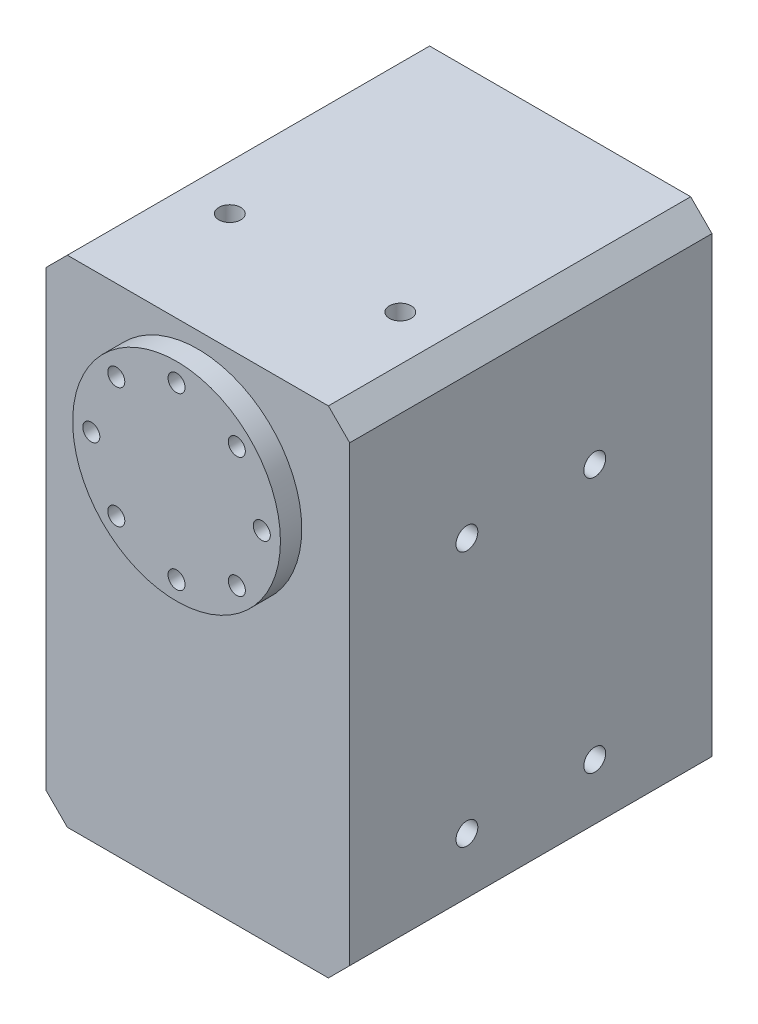
ISO-10303-21;
HEADER;
FILE_DESCRIPTION(('STEP AP214'),'2;1');
FILE_NAME('part.step','',(''),(''),'','','');
FILE_SCHEMA(('AUTOMOTIVE_DESIGN { 1 0 10303 214 1 1 1 1 }'));
ENDSEC;
DATA;
#1=APPLICATION_CONTEXT('core data for automotive mechanical design processes');
#2=APPLICATION_PROTOCOL_DEFINITION('international standard','automotive_design',2000,#1);
#3=PRODUCT_CONTEXT('',#1,'mechanical');
#4=PRODUCT('Part','Part','',(#3));
#5=PRODUCT_RELATED_PRODUCT_CATEGORY('part','',(#4));
#6=PRODUCT_DEFINITION_FORMATION('','',#4);
#7=PRODUCT_DEFINITION_CONTEXT('part definition',#1,'design');
#8=PRODUCT_DEFINITION('design','',#6,#7);
#9=PRODUCT_DEFINITION_SHAPE('','',#8);
#10=(LENGTH_UNIT() NAMED_UNIT(*) SI_UNIT(.MILLI.,.METRE.));
#11=(NAMED_UNIT(*) PLANE_ANGLE_UNIT() SI_UNIT($,.RADIAN.));
#12=(NAMED_UNIT(*) SI_UNIT($,.STERADIAN.) SOLID_ANGLE_UNIT());
#13=UNCERTAINTY_MEASURE_WITH_UNIT(LENGTH_MEASURE(1.E-05),#10,'distance_accuracy_value','');
#14=(GEOMETRIC_REPRESENTATION_CONTEXT(3) GLOBAL_UNCERTAINTY_ASSIGNED_CONTEXT((#13)) GLOBAL_UNIT_ASSIGNED_CONTEXT((#10,
#11,#12)) REPRESENTATION_CONTEXT('',''));
#15=CARTESIAN_POINT('',(0.,0.,0.));
#16=DIRECTION('',(0.,0.,1.));
#17=DIRECTION('',(1.,0.,0.));
#18=AXIS2_PLACEMENT_3D('',#15,#16,#17);
#19=CARTESIAN_POINT('',(-14.25,23.25,34.));
#20=DIRECTION('',(1.,0.,0.));
#21=DIRECTION('',(0.,1.,0.));
#22=AXIS2_PLACEMENT_3D('',#19,#20,#21);
#23=PLANE('',#22);
#24=CARTESIAN_POINT('',(-14.25,8.,11.));
#25=DIRECTION('',(-1.,0.,0.));
#26=DIRECTION('',(0.,-1.,0.));
#27=AXIS2_PLACEMENT_3D('',#24,#25,#26);
#28=CIRCLE('',#27,1.025);
#29=CARTESIAN_POINT('',(-14.25,6.975,11.));
#30=VERTEX_POINT('',#29);
#31=EDGE_CURVE('E316',#30,#30,#28,.T.);
#32=ORIENTED_EDGE('',*,*,#31,.F.);
#33=EDGE_LOOP('',(#32));
#34=FACE_BOUND('',#33,.T.);
#35=CARTESIAN_POINT('',(-14.25,-16.,23.));
#36=DIRECTION('',(-1.,0.,0.));
#37=DIRECTION('',(0.,-1.,0.));
#38=AXIS2_PLACEMENT_3D('',#35,#36,#37);
#39=CIRCLE('',#38,1.02499999999999);
#40=CARTESIAN_POINT('',(-14.25,-17.025,23.));
#41=VERTEX_POINT('',#40);
#42=EDGE_CURVE('E307',#41,#41,#39,.T.);
#43=ORIENTED_EDGE('',*,*,#42,.F.);
#44=EDGE_LOOP('',(#43));
#45=FACE_BOUND('',#44,.T.);
#46=CARTESIAN_POINT('',(-14.25,-16.,11.));
#47=DIRECTION('',(-1.,0.,0.));
#48=DIRECTION('',(0.,-1.,0.));
#49=AXIS2_PLACEMENT_3D('',#46,#47,#48);
#50=CIRCLE('',#49,1.025);
#51=CARTESIAN_POINT('',(-14.25,-17.025,11.));
#52=VERTEX_POINT('',#51);
#53=EDGE_CURVE('E323',#52,#52,#50,.T.);
#54=ORIENTED_EDGE('',*,*,#53,.F.);
#55=EDGE_LOOP('',(#54));
#56=FACE_BOUND('',#55,.T.);
#57=CARTESIAN_POINT('',(-14.25,8.,23.));
#58=DIRECTION('',(-1.,0.,0.));
#59=DIRECTION('',(0.,-1.,0.));
#60=AXIS2_PLACEMENT_3D('',#57,#58,#59);
#61=CIRCLE('',#60,1.025);
#62=CARTESIAN_POINT('',(-14.25,6.975,23.));
#63=VERTEX_POINT('',#62);
#64=EDGE_CURVE('E299',#63,#63,#61,.T.);
#65=ORIENTED_EDGE('',*,*,#64,.F.);
#66=EDGE_LOOP('',(#65));
#67=FACE_BOUND('',#66,.T.);
#68=DIRECTION('',(0.,-1.,0.));
#69=VECTOR('',#68,1.);
#70=CARTESIAN_POINT('',(-14.25,23.25,34.));
#71=LINE('',#70,#69);
#72=CARTESIAN_POINT('',(-14.25,21.25,34.));
#73=VERTEX_POINT('',#72);
#74=CARTESIAN_POINT('',(-14.25,-21.25,34.));
#75=VERTEX_POINT('',#74);
#76=EDGE_CURVE('E145',#73,#75,#71,.T.);
#77=ORIENTED_EDGE('',*,*,#76,.F.);
#78=DIRECTION('',(0.,0.,-1.));
#79=VECTOR('',#78,1.);
#80=CARTESIAN_POINT('',(-14.25,21.25,34.));
#81=LINE('',#80,#79);
#82=CARTESIAN_POINT('',(-14.25,21.25,0.));
#83=VERTEX_POINT('',#82);
#84=EDGE_CURVE('E11',#73,#83,#81,.T.);
#85=ORIENTED_EDGE('',*,*,#84,.T.);
#86=DIRECTION('',(0.,-1.,0.));
#87=VECTOR('',#86,1.);
#88=CARTESIAN_POINT('',(-14.25,23.25,0.));
#89=LINE('',#88,#87);
#90=CARTESIAN_POINT('',(-14.25,-21.25,0.));
#91=VERTEX_POINT('',#90);
#92=EDGE_CURVE('E147',#83,#91,#89,.T.);
#93=ORIENTED_EDGE('',*,*,#92,.T.);
#94=DIRECTION('',(0.,0.,1.));
#95=VECTOR('',#94,1.);
#96=CARTESIAN_POINT('',(-14.25,-21.25,34.));
#97=LINE('',#96,#95);
#98=EDGE_CURVE('E53',#91,#75,#97,.T.);
#99=ORIENTED_EDGE('',*,*,#98,.T.);
#100=EDGE_LOOP('',(#77,#85,#93,#99));
#101=FACE_BOUND('',#100,.T.);
#102=ADVANCED_FACE('F43',(#34,#45,#56,#67,#101),#23,.F.);
#103=CARTESIAN_POINT('',(-14.25,-23.25,34.));
#104=DIRECTION('',(0.,1.,0.));
#105=DIRECTION('',(0.,0.,1.));
#106=AXIS2_PLACEMENT_3D('',#103,#104,#105);
#107=PLANE('',#106);
#108=CARTESIAN_POINT('',(8.,-23.25,23.));
#109=DIRECTION('',(0.,-1.,0.));
#110=DIRECTION('',(0.,0.,-1.));
#111=AXIS2_PLACEMENT_3D('',#108,#109,#110);
#112=CIRCLE('',#111,1.025);
#113=CARTESIAN_POINT('',(8.,-23.25,21.975));
#114=VERTEX_POINT('',#113);
#115=EDGE_CURVE('E380',#114,#114,#112,.T.);
#116=ORIENTED_EDGE('',*,*,#115,.F.);
#117=EDGE_LOOP('',(#116));
#118=FACE_BOUND('',#117,.T.);
#119=CARTESIAN_POINT('',(-8.,-23.25,11.));
#120=DIRECTION('',(0.,-1.,0.));
#121=DIRECTION('',(0.,0.,-1.));
#122=AXIS2_PLACEMENT_3D('',#119,#120,#121);
#123=CIRCLE('',#122,1.025);
#124=CARTESIAN_POINT('',(-8.,-23.25,9.975));
#125=VERTEX_POINT('',#124);
#126=EDGE_CURVE('E371',#125,#125,#123,.T.);
#127=ORIENTED_EDGE('',*,*,#126,.F.);
#128=EDGE_LOOP('',(#127));
#129=FACE_BOUND('',#128,.T.);
#130=CARTESIAN_POINT('',(8.,-23.25,11.));
#131=DIRECTION('',(0.,-1.,0.));
#132=DIRECTION('',(0.,0.,-1.));
#133=AXIS2_PLACEMENT_3D('',#130,#131,#132);
#134=CIRCLE('',#133,1.025);
#135=CARTESIAN_POINT('',(8.,-23.25,9.975));
#136=VERTEX_POINT('',#135);
#137=EDGE_CURVE('E387',#136,#136,#134,.T.);
#138=ORIENTED_EDGE('',*,*,#137,.F.);
#139=EDGE_LOOP('',(#138));
#140=FACE_BOUND('',#139,.T.);
#141=CARTESIAN_POINT('',(-8.,-23.25,23.));
#142=DIRECTION('',(0.,-1.,0.));
#143=DIRECTION('',(0.,0.,-1.));
#144=AXIS2_PLACEMENT_3D('',#141,#142,#143);
#145=CIRCLE('',#144,1.025);
#146=CARTESIAN_POINT('',(-8.,-23.25,21.975));
#147=VERTEX_POINT('',#146);
#148=EDGE_CURVE('E363',#147,#147,#145,.T.);
#149=ORIENTED_EDGE('',*,*,#148,.F.);
#150=EDGE_LOOP('',(#149));
#151=FACE_BOUND('',#150,.T.);
#152=DIRECTION('',(1.,0.,0.));
#153=VECTOR('',#152,1.);
#154=CARTESIAN_POINT('',(-14.25,-23.25,0.));
#155=LINE('',#154,#153);
#156=CARTESIAN_POINT('',(-12.25,-23.25,0.));
#157=VERTEX_POINT('',#156);
#158=CARTESIAN_POINT('',(12.25,-23.25,0.));
#159=VERTEX_POINT('',#158);
#160=EDGE_CURVE('E141',#157,#159,#155,.T.);
#161=ORIENTED_EDGE('',*,*,#160,.T.);
#162=DIRECTION('',(0.,0.,1.));
#163=VECTOR('',#162,1.);
#164=CARTESIAN_POINT('',(12.25,-23.25,34.));
#165=LINE('',#164,#163);
#166=CARTESIAN_POINT('',(12.25,-23.25,34.));
#167=VERTEX_POINT('',#166);
#168=EDGE_CURVE('E117',#159,#167,#165,.T.);
#169=ORIENTED_EDGE('',*,*,#168,.T.);
#170=DIRECTION('',(1.,0.,0.));
#171=VECTOR('',#170,1.);
#172=CARTESIAN_POINT('',(-14.25,-23.25,34.));
#173=LINE('',#172,#171);
#174=CARTESIAN_POINT('',(-12.25,-23.25,34.));
#175=VERTEX_POINT('',#174);
#176=EDGE_CURVE('E197',#175,#167,#173,.T.);
#177=ORIENTED_EDGE('',*,*,#176,.F.);
#178=DIRECTION('',(0.,0.,-1.));
#179=VECTOR('',#178,1.);
#180=CARTESIAN_POINT('',(-12.25,-23.25,34.));
#181=LINE('',#180,#179);
#182=EDGE_CURVE('E123',#175,#157,#181,.T.);
#183=ORIENTED_EDGE('',*,*,#182,.T.);
#184=EDGE_LOOP('',(#161,#169,#177,#183));
#185=FACE_BOUND('',#184,.T.);
#186=ADVANCED_FACE('F201',(#118,#129,#140,#151,#185),#107,.F.);
#187=CARTESIAN_POINT('',(14.25,23.25,34.));
#188=DIRECTION('',(-1.,0.,0.));
#189=DIRECTION('',(0.,-1.,0.));
#190=AXIS2_PLACEMENT_3D('',#187,#188,#189);
#191=PLANE('',#190);
#192=CARTESIAN_POINT('',(14.25,8.,11.));
#193=DIRECTION('',(1.,0.,0.));
#194=DIRECTION('',(0.,1.,0.));
#195=AXIS2_PLACEMENT_3D('',#192,#193,#194);
#196=CIRCLE('',#195,1.025);
#197=CARTESIAN_POINT('',(14.25,9.025,11.));
#198=VERTEX_POINT('',#197);
#199=EDGE_CURVE('E339',#198,#198,#196,.T.);
#200=ORIENTED_EDGE('',*,*,#199,.F.);
#201=EDGE_LOOP('',(#200));
#202=FACE_BOUND('',#201,.T.);
#203=CARTESIAN_POINT('',(14.25,8.,23.));
#204=DIRECTION('',(1.,0.,0.));
#205=DIRECTION('',(0.,1.,0.));
#206=AXIS2_PLACEMENT_3D('',#203,#204,#205);
#207=CIRCLE('',#206,1.025);
#208=CARTESIAN_POINT('',(14.25,9.025,23.));
#209=VERTEX_POINT('',#208);
#210=EDGE_CURVE('E348',#209,#209,#207,.T.);
#211=ORIENTED_EDGE('',*,*,#210,.F.);
#212=EDGE_LOOP('',(#211));
#213=FACE_BOUND('',#212,.T.);
#214=CARTESIAN_POINT('',(14.25,-16.,23.));
#215=DIRECTION('',(1.,0.,0.));
#216=DIRECTION('',(0.,1.,0.));
#217=AXIS2_PLACEMENT_3D('',#214,#215,#216);
#218=CIRCLE('',#217,1.02499999999999);
#219=CARTESIAN_POINT('',(14.25,-14.975,23.));
#220=VERTEX_POINT('',#219);
#221=EDGE_CURVE('E356',#220,#220,#218,.T.);
#222=ORIENTED_EDGE('',*,*,#221,.F.);
#223=EDGE_LOOP('',(#222));
#224=FACE_BOUND('',#223,.T.);
#225=CARTESIAN_POINT('',(14.25,-16.,11.));
#226=DIRECTION('',(1.,0.,0.));
#227=DIRECTION('',(0.,1.,0.));
#228=AXIS2_PLACEMENT_3D('',#225,#226,#227);
#229=CIRCLE('',#228,1.025);
#230=CARTESIAN_POINT('',(14.25,-14.975,11.));
#231=VERTEX_POINT('',#230);
#232=EDGE_CURVE('E331',#231,#231,#229,.T.);
#233=ORIENTED_EDGE('',*,*,#232,.F.);
#234=EDGE_LOOP('',(#233));
#235=FACE_BOUND('',#234,.T.);
#236=DIRECTION('',(0.,1.,0.));
#237=VECTOR('',#236,1.);
#238=CARTESIAN_POINT('',(14.25,23.25,34.));
#239=LINE('',#238,#237);
#240=CARTESIAN_POINT('',(14.25,-21.25,34.));
#241=VERTEX_POINT('',#240);
#242=CARTESIAN_POINT('',(14.25,21.25,34.));
#243=VERTEX_POINT('',#242);
#244=EDGE_CURVE('E132',#241,#243,#239,.T.);
#245=ORIENTED_EDGE('',*,*,#244,.F.);
#246=DIRECTION('',(0.,0.,-1.));
#247=VECTOR('',#246,1.);
#248=CARTESIAN_POINT('',(14.25,-21.25,34.));
#249=LINE('',#248,#247);
#250=CARTESIAN_POINT('',(14.25,-21.25,0.));
#251=VERTEX_POINT('',#250);
#252=EDGE_CURVE('E116',#241,#251,#249,.T.);
#253=ORIENTED_EDGE('',*,*,#252,.T.);
#254=DIRECTION('',(0.,1.,0.));
#255=VECTOR('',#254,1.);
#256=CARTESIAN_POINT('',(14.25,23.25,0.));
#257=LINE('',#256,#255);
#258=CARTESIAN_POINT('',(14.25,21.25,0.));
#259=VERTEX_POINT('',#258);
#260=EDGE_CURVE('E130',#251,#259,#257,.T.);
#261=ORIENTED_EDGE('',*,*,#260,.T.);
#262=DIRECTION('',(0.,0.,1.));
#263=VECTOR('',#262,1.);
#264=CARTESIAN_POINT('',(14.25,21.25,34.));
#265=LINE('',#264,#263);
#266=EDGE_CURVE('E135',#259,#243,#265,.T.);
#267=ORIENTED_EDGE('',*,*,#266,.T.);
#268=EDGE_LOOP('',(#245,#253,#261,#267));
#269=FACE_BOUND('',#268,.T.);
#270=ADVANCED_FACE('F129',(#202,#213,#224,#235,#269),#191,.F.);
#271=CARTESIAN_POINT('',(-14.25,23.25,34.));
#272=DIRECTION('',(0.,-1.,0.));
#273=DIRECTION('',(0.,0.,-1.));
#274=AXIS2_PLACEMENT_3D('',#271,#272,#273);
#275=PLANE('',#274);
#276=CARTESIAN_POINT('',(-8.,23.25,23.));
#277=DIRECTION('',(0.,1.,0.));
#278=DIRECTION('',(0.,0.,1.));
#279=AXIS2_PLACEMENT_3D('',#276,#277,#278);
#280=CIRCLE('',#279,1.025);
#281=CARTESIAN_POINT('',(-8.,23.25,24.025));
#282=VERTEX_POINT('',#281);
#283=EDGE_CURVE('E292',#282,#282,#280,.T.);
#284=ORIENTED_EDGE('',*,*,#283,.F.);
#285=EDGE_LOOP('',(#284));
#286=FACE_BOUND('',#285,.T.);
#287=CARTESIAN_POINT('',(8.,23.25,23.));
#288=DIRECTION('',(0.,1.,0.));
#289=DIRECTION('',(0.,0.,1.));
#290=AXIS2_PLACEMENT_3D('',#287,#288,#289);
#291=CIRCLE('',#290,1.025);
#292=CARTESIAN_POINT('',(8.,23.25,24.025));
#293=VERTEX_POINT('',#292);
#294=EDGE_CURVE('E283',#293,#293,#291,.T.);
#295=ORIENTED_EDGE('',*,*,#294,.F.);
#296=EDGE_LOOP('',(#295));
#297=FACE_BOUND('',#296,.T.);
#298=DIRECTION('',(-1.,0.,0.));
#299=VECTOR('',#298,1.);
#300=CARTESIAN_POINT('',(-14.25,23.25,34.));
#301=LINE('',#300,#299);
#302=CARTESIAN_POINT('',(12.25,23.25,34.));
#303=VERTEX_POINT('',#302);
#304=CARTESIAN_POINT('',(-12.25,23.25,34.));
#305=VERTEX_POINT('',#304);
#306=EDGE_CURVE('E209',#303,#305,#301,.T.);
#307=ORIENTED_EDGE('',*,*,#306,.F.);
#308=DIRECTION('',(0.,0.,-1.));
#309=VECTOR('',#308,1.);
#310=CARTESIAN_POINT('',(12.25,23.25,34.));
#311=LINE('',#310,#309);
#312=CARTESIAN_POINT('',(12.25,23.25,0.));
#313=VERTEX_POINT('',#312);
#314=EDGE_CURVE('E179',#303,#313,#311,.T.);
#315=ORIENTED_EDGE('',*,*,#314,.T.);
#316=DIRECTION('',(-1.,0.,0.));
#317=VECTOR('',#316,1.);
#318=CARTESIAN_POINT('',(-14.25,23.25,0.));
#319=LINE('',#318,#317);
#320=CARTESIAN_POINT('',(-12.25,23.25,0.));
#321=VERTEX_POINT('',#320);
#322=EDGE_CURVE('E140',#313,#321,#319,.T.);
#323=ORIENTED_EDGE('',*,*,#322,.T.);
#324=DIRECTION('',(0.,0.,1.));
#325=VECTOR('',#324,1.);
#326=CARTESIAN_POINT('',(-12.25,23.25,34.));
#327=LINE('',#326,#325);
#328=EDGE_CURVE('E60',#321,#305,#327,.T.);
#329=ORIENTED_EDGE('',*,*,#328,.T.);
#330=EDGE_LOOP('',(#307,#315,#323,#329));
#331=FACE_BOUND('',#330,.T.);
#332=ADVANCED_FACE('F496',(#286,#297,#331),#275,.F.);
#333=CARTESIAN_POINT('',(0.,0.,34.));
#334=DIRECTION('',(0.,0.,1.));
#335=DIRECTION('',(1.,0.,0.));
#336=AXIS2_PLACEMENT_3D('',#333,#334,#335);
#337=PLANE('',#336);
#338=CARTESIAN_POINT('',(0.,12.,34.));
#339=DIRECTION('',(0.,0.,1.));
#340=DIRECTION('',(1.,0.,0.));
#341=AXIS2_PLACEMENT_3D('',#338,#339,#340);
#342=CIRCLE('',#341,9.75);
#343=CARTESIAN_POINT('',(9.75,12.,34.));
#344=VERTEX_POINT('',#343);
#345=EDGE_CURVE('E152',#344,#344,#342,.T.);
#346=ORIENTED_EDGE('',*,*,#345,.F.);
#347=EDGE_LOOP('',(#346));
#348=FACE_BOUND('',#347,.T.);
#349=ORIENTED_EDGE('',*,*,#176,.T.);
#350=DIRECTION('',(-0.707106781186549,-0.707106781186546,0.));
#351=VECTOR('',#350,1.);
#352=CARTESIAN_POINT('',(17.75,-17.7500000000001,34.));
#353=LINE('',#352,#351);
#354=EDGE_CURVE('E174',#167,#241,#353,.F.);
#355=ORIENTED_EDGE('',*,*,#354,.T.);
#356=ORIENTED_EDGE('',*,*,#244,.T.);
#357=DIRECTION('',(0.707106781186546,-0.707106781186549,0.));
#358=VECTOR('',#357,1.);
#359=CARTESIAN_POINT('',(17.75,17.75,34.));
#360=LINE('',#359,#358);
#361=EDGE_CURVE('E67',#243,#303,#360,.F.);
#362=ORIENTED_EDGE('',*,*,#361,.T.);
#363=ORIENTED_EDGE('',*,*,#306,.T.);
#364=DIRECTION('',(0.707106781186549,0.707106781186546,0.));
#365=VECTOR('',#364,1.);
#366=CARTESIAN_POINT('',(-17.75,17.75,34.));
#367=LINE('',#366,#365);
#368=EDGE_CURVE('E169',#305,#73,#367,.F.);
#369=ORIENTED_EDGE('',*,*,#368,.T.);
#370=ORIENTED_EDGE('',*,*,#76,.T.);
#371=DIRECTION('',(-0.707106781186546,0.707106781186549,0.));
#372=VECTOR('',#371,1.);
#373=CARTESIAN_POINT('',(-17.75,-17.75,34.));
#374=LINE('',#373,#372);
#375=EDGE_CURVE('E166',#75,#175,#374,.F.);
#376=ORIENTED_EDGE('',*,*,#375,.T.);
#377=EDGE_LOOP('',(#349,#355,#356,#362,#363,#369,#370,#376));
#378=FACE_BOUND('',#377,.T.);
#379=ADVANCED_FACE('F193',(#348,#378),#337,.T.);
#380=CARTESIAN_POINT('',(0.,0.,0.));
#381=DIRECTION('',(0.,0.,1.));
#382=DIRECTION('',(1.,0.,0.));
#383=AXIS2_PLACEMENT_3D('',#380,#381,#382);
#384=PLANE('',#383);
#385=ORIENTED_EDGE('',*,*,#260,.F.);
#386=DIRECTION('',(0.707106781186549,0.707106781186546,0.));
#387=VECTOR('',#386,1.);
#388=CARTESIAN_POINT('',(14.25,-21.25,0.));
#389=LINE('',#388,#387);
#390=EDGE_CURVE('E112',#251,#159,#389,.F.);
#391=ORIENTED_EDGE('',*,*,#390,.T.);
#392=ORIENTED_EDGE('',*,*,#160,.F.);
#393=DIRECTION('',(0.707106781186546,-0.707106781186549,0.));
#394=VECTOR('',#393,1.);
#395=CARTESIAN_POINT('',(-12.25,-23.25,0.));
#396=LINE('',#395,#394);
#397=EDGE_CURVE('E134',#157,#91,#396,.F.);
#398=ORIENTED_EDGE('',*,*,#397,.T.);
#399=ORIENTED_EDGE('',*,*,#92,.F.);
#400=DIRECTION('',(-0.707106781186549,-0.707106781186546,0.));
#401=VECTOR('',#400,1.);
#402=CARTESIAN_POINT('',(-14.25,21.25,0.));
#403=LINE('',#402,#401);
#404=EDGE_CURVE('E156',#83,#321,#403,.F.);
#405=ORIENTED_EDGE('',*,*,#404,.T.);
#406=ORIENTED_EDGE('',*,*,#322,.F.);
#407=DIRECTION('',(-0.707106781186546,0.707106781186549,0.));
#408=VECTOR('',#407,1.);
#409=CARTESIAN_POINT('',(12.25,23.25,0.));
#410=LINE('',#409,#408);
#411=EDGE_CURVE('E124',#313,#259,#410,.F.);
#412=ORIENTED_EDGE('',*,*,#411,.T.);
#413=EDGE_LOOP('',(#385,#391,#392,#398,#399,#405,#406,#412));
#414=FACE_BOUND('',#413,.T.);
#415=ADVANCED_FACE('F137',(#414),#384,.F.);
#416=CARTESIAN_POINT('',(0.,12.,36.));
#417=DIRECTION('',(0.,0.,1.));
#418=DIRECTION('',(1.,0.,0.));
#419=AXIS2_PLACEMENT_3D('',#416,#417,#418);
#420=PLANE('',#419);
#421=CARTESIAN_POINT('',(-7.99999999999977,11.9999999999999,36.));
#422=DIRECTION('',(0.,0.,1.));
#423=DIRECTION('',(1.,0.,0.));
#424=AXIS2_PLACEMENT_3D('',#421,#422,#423);
#425=CIRCLE('',#424,0.8);
#426=CARTESIAN_POINT('',(-7.19999999999977,11.9999999999999,36.));
#427=VERTEX_POINT('',#426);
#428=EDGE_CURVE('E263',#427,#427,#425,.T.);
#429=ORIENTED_EDGE('',*,*,#428,.F.);
#430=EDGE_LOOP('',(#429));
#431=FACE_BOUND('',#430,.T.);
#432=CARTESIAN_POINT('',(0.,4.,36.));
#433=DIRECTION('',(0.,0.,1.));
#434=DIRECTION('',(1.,0.,0.));
#435=AXIS2_PLACEMENT_3D('',#432,#433,#434);
#436=CIRCLE('',#435,0.799999999999622);
#437=CARTESIAN_POINT('',(0.799999999999623,4.,36.));
#438=VERTEX_POINT('',#437);
#439=EDGE_CURVE('E247',#438,#438,#436,.T.);
#440=ORIENTED_EDGE('',*,*,#439,.F.);
#441=EDGE_LOOP('',(#440));
#442=FACE_BOUND('',#441,.T.);
#443=CARTESIAN_POINT('',(8.00000000000023,12.0000000000002,36.));
#444=DIRECTION('',(0.,0.,1.));
#445=DIRECTION('',(1.,0.,0.));
#446=AXIS2_PLACEMENT_3D('',#443,#444,#445);
#447=CIRCLE('',#446,0.799999999999999);
#448=CARTESIAN_POINT('',(8.80000000000022,12.0000000000002,36.));
#449=VERTEX_POINT('',#448);
#450=EDGE_CURVE('E231',#449,#449,#447,.T.);
#451=ORIENTED_EDGE('',*,*,#450,.F.);
#452=EDGE_LOOP('',(#451));
#453=FACE_BOUND('',#452,.T.);
#454=CARTESIAN_POINT('',(0.,20.,36.));
#455=DIRECTION('',(0.,0.,1.));
#456=DIRECTION('',(1.,0.,0.));
#457=AXIS2_PLACEMENT_3D('',#454,#455,#456);
#458=CIRCLE('',#457,0.799999999999999);
#459=CARTESIAN_POINT('',(0.799999999999999,20.,36.));
#460=VERTEX_POINT('',#459);
#461=EDGE_CURVE('E206',#460,#460,#458,.T.);
#462=ORIENTED_EDGE('',*,*,#461,.F.);
#463=EDGE_LOOP('',(#462));
#464=FACE_BOUND('',#463,.T.);
#465=CARTESIAN_POINT('',(0.,12.,36.));
#466=DIRECTION('',(0.,0.,1.));
#467=DIRECTION('',(1.,0.,0.));
#468=AXIS2_PLACEMENT_3D('',#465,#466,#467);
#469=CIRCLE('',#468,9.75);
#470=CARTESIAN_POINT('',(9.75,12.,36.));
#471=VERTEX_POINT('',#470);
#472=EDGE_CURVE('E203',#471,#471,#469,.T.);
#473=ORIENTED_EDGE('',*,*,#472,.T.);
#474=EDGE_LOOP('',(#473));
#475=FACE_BOUND('',#474,.T.);
#476=CARTESIAN_POINT('',(5.65685424949246,17.6568542494925,36.));
#477=DIRECTION('',(0.,0.,1.));
#478=DIRECTION('',(1.,0.,0.));
#479=AXIS2_PLACEMENT_3D('',#476,#477,#478);
#480=CIRCLE('',#479,0.799999999999998);
#481=CARTESIAN_POINT('',(6.45685424949245,17.6568542494925,36.));
#482=VERTEX_POINT('',#481);
#483=EDGE_CURVE('E223',#482,#482,#480,.T.);
#484=ORIENTED_EDGE('',*,*,#483,.F.);
#485=EDGE_LOOP('',(#484));
#486=FACE_BOUND('',#485,.T.);
#487=CARTESIAN_POINT('',(5.65685424949238,6.34314575050762,36.));
#488=DIRECTION('',(0.,0.,1.));
#489=DIRECTION('',(1.,0.,0.));
#490=AXIS2_PLACEMENT_3D('',#487,#488,#489);
#491=CIRCLE('',#490,0.799999999999719);
#492=CARTESIAN_POINT('',(6.4568542494921,6.34314575050762,36.));
#493=VERTEX_POINT('',#492);
#494=EDGE_CURVE('E239',#493,#493,#491,.T.);
#495=ORIENTED_EDGE('',*,*,#494,.F.);
#496=EDGE_LOOP('',(#495));
#497=FACE_BOUND('',#496,.T.);
#498=CARTESIAN_POINT('',(-5.65685424949238,6.34314575050762,36.));
#499=DIRECTION('',(0.,0.,1.));
#500=DIRECTION('',(1.,0.,0.));
#501=AXIS2_PLACEMENT_3D('',#498,#499,#500);
#502=CIRCLE('',#501,0.79999999999965);
#503=CARTESIAN_POINT('',(-4.85685424949273,6.34314575050762,36.));
#504=VERTEX_POINT('',#503);
#505=EDGE_CURVE('E255',#504,#504,#502,.T.);
#506=ORIENTED_EDGE('',*,*,#505,.F.);
#507=EDGE_LOOP('',(#506));
#508=FACE_BOUND('',#507,.T.);
#509=CARTESIAN_POINT('',(-5.65685424949224,17.6568542494923,36.));
#510=DIRECTION('',(0.,0.,1.));
#511=DIRECTION('',(1.,0.,0.));
#512=AXIS2_PLACEMENT_3D('',#509,#510,#511);
#513=CIRCLE('',#512,0.799999999999999);
#514=CARTESIAN_POINT('',(-4.85685424949224,17.6568542494923,36.));
#515=VERTEX_POINT('',#514);
#516=EDGE_CURVE('E271',#515,#515,#513,.T.);
#517=ORIENTED_EDGE('',*,*,#516,.F.);
#518=EDGE_LOOP('',(#517));
#519=FACE_BOUND('',#518,.T.);
#520=ADVANCED_FACE('F485',(#431,#442,#453,#464,#475,#486,#497,#508,#519),#420,.T.);
#521=CARTESIAN_POINT('',(0.,12.,36.));
#522=DIRECTION('',(0.,0.,-1.));
#523=DIRECTION('',(-1.,0.,0.));
#524=AXIS2_PLACEMENT_3D('',#521,#522,#523);
#525=CYLINDRICAL_SURFACE('',#524,9.75);
#526=ORIENTED_EDGE('',*,*,#472,.F.);
#527=EDGE_LOOP('',(#526));
#528=FACE_BOUND('',#527,.T.);
#529=ORIENTED_EDGE('',*,*,#345,.T.);
#530=EDGE_LOOP('',(#529));
#531=FACE_BOUND('',#530,.T.);
#532=ADVANCED_FACE('F931',(#528,#531),#525,.T.);
#533=CARTESIAN_POINT('',(0.,20.,36.));
#534=DIRECTION('',(0.,0.,-1.));
#535=DIRECTION('',(-1.,0.,0.));
#536=AXIS2_PLACEMENT_3D('',#533,#534,#535);
#537=CYLINDRICAL_SURFACE('',#536,0.799999999999999);
#538=ORIENTED_EDGE('',*,*,#461,.T.);
#539=EDGE_LOOP('',(#538));
#540=FACE_BOUND('',#539,.T.);
#541=CARTESIAN_POINT('',(0.,20.,34.));
#542=DIRECTION('',(0.,0.,1.));
#543=DIRECTION('',(1.,0.,0.));
#544=AXIS2_PLACEMENT_3D('',#541,#542,#543);
#545=CIRCLE('',#544,0.799999999999999);
#546=CARTESIAN_POINT('',(0.799999999999999,20.,34.));
#547=VERTEX_POINT('',#546);
#548=EDGE_CURVE('E219',#547,#547,#545,.T.);
#549=ORIENTED_EDGE('',*,*,#548,.F.);
#550=EDGE_LOOP('',(#549));
#551=FACE_BOUND('',#550,.T.);
#552=ADVANCED_FACE('F921',(#540,#551),#537,.F.);
#553=CARTESIAN_POINT('',(5.65685424949246,17.6568542494925,36.));
#554=DIRECTION('',(0.,0.,-1.));
#555=DIRECTION('',(-1.,0.,0.));
#556=AXIS2_PLACEMENT_3D('',#553,#554,#555);
#557=CYLINDRICAL_SURFACE('',#556,0.799999999999998);
#558=ORIENTED_EDGE('',*,*,#483,.T.);
#559=EDGE_LOOP('',(#558));
#560=FACE_BOUND('',#559,.T.);
#561=CARTESIAN_POINT('',(5.65685424949246,17.6568542494925,34.));
#562=DIRECTION('',(0.,0.,1.));
#563=DIRECTION('',(1.,0.,0.));
#564=AXIS2_PLACEMENT_3D('',#561,#562,#563);
#565=CIRCLE('',#564,0.799999999999998);
#566=CARTESIAN_POINT('',(6.45685424949245,17.6568542494925,34.));
#567=VERTEX_POINT('',#566);
#568=EDGE_CURVE('E227',#567,#567,#565,.T.);
#569=ORIENTED_EDGE('',*,*,#568,.F.);
#570=EDGE_LOOP('',(#569));
#571=FACE_BOUND('',#570,.T.);
#572=ADVANCED_FACE('F911',(#560,#571),#557,.F.);
#573=CARTESIAN_POINT('',(8.00000000000023,12.0000000000002,36.));
#574=DIRECTION('',(0.,0.,-1.));
#575=DIRECTION('',(-1.,0.,0.));
#576=AXIS2_PLACEMENT_3D('',#573,#574,#575);
#577=CYLINDRICAL_SURFACE('',#576,0.799999999999999);
#578=ORIENTED_EDGE('',*,*,#450,.T.);
#579=EDGE_LOOP('',(#578));
#580=FACE_BOUND('',#579,.T.);
#581=CARTESIAN_POINT('',(8.00000000000023,12.0000000000002,34.));
#582=DIRECTION('',(0.,0.,1.));
#583=DIRECTION('',(1.,0.,0.));
#584=AXIS2_PLACEMENT_3D('',#581,#582,#583);
#585=CIRCLE('',#584,0.799999999999999);
#586=CARTESIAN_POINT('',(8.80000000000022,12.0000000000002,34.));
#587=VERTEX_POINT('',#586);
#588=EDGE_CURVE('E235',#587,#587,#585,.T.);
#589=ORIENTED_EDGE('',*,*,#588,.F.);
#590=EDGE_LOOP('',(#589));
#591=FACE_BOUND('',#590,.T.);
#592=ADVANCED_FACE('F901',(#580,#591),#577,.F.);
#593=CARTESIAN_POINT('',(5.65685424949238,6.34314575050762,36.));
#594=DIRECTION('',(0.,0.,-1.));
#595=DIRECTION('',(-1.,0.,0.));
#596=AXIS2_PLACEMENT_3D('',#593,#594,#595);
#597=CYLINDRICAL_SURFACE('',#596,0.799999999999719);
#598=ORIENTED_EDGE('',*,*,#494,.T.);
#599=EDGE_LOOP('',(#598));
#600=FACE_BOUND('',#599,.T.);
#601=CARTESIAN_POINT('',(5.65685424949238,6.34314575050762,34.));
#602=DIRECTION('',(0.,0.,1.));
#603=DIRECTION('',(1.,0.,0.));
#604=AXIS2_PLACEMENT_3D('',#601,#602,#603);
#605=CIRCLE('',#604,0.799999999999719);
#606=CARTESIAN_POINT('',(6.4568542494921,6.34314575050762,34.));
#607=VERTEX_POINT('',#606);
#608=EDGE_CURVE('E243',#607,#607,#605,.T.);
#609=ORIENTED_EDGE('',*,*,#608,.F.);
#610=EDGE_LOOP('',(#609));
#611=FACE_BOUND('',#610,.T.);
#612=ADVANCED_FACE('F891',(#600,#611),#597,.F.);
#613=CARTESIAN_POINT('',(0.,4.,36.));
#614=DIRECTION('',(0.,0.,-1.));
#615=DIRECTION('',(-1.,0.,0.));
#616=AXIS2_PLACEMENT_3D('',#613,#614,#615);
#617=CYLINDRICAL_SURFACE('',#616,0.799999999999622);
#618=ORIENTED_EDGE('',*,*,#439,.T.);
#619=EDGE_LOOP('',(#618));
#620=FACE_BOUND('',#619,.T.);
#621=CARTESIAN_POINT('',(0.,4.,34.));
#622=DIRECTION('',(0.,0.,1.));
#623=DIRECTION('',(1.,0.,0.));
#624=AXIS2_PLACEMENT_3D('',#621,#622,#623);
#625=CIRCLE('',#624,0.799999999999622);
#626=CARTESIAN_POINT('',(0.799999999999623,4.,34.));
#627=VERTEX_POINT('',#626);
#628=EDGE_CURVE('E251',#627,#627,#625,.T.);
#629=ORIENTED_EDGE('',*,*,#628,.F.);
#630=EDGE_LOOP('',(#629));
#631=FACE_BOUND('',#630,.T.);
#632=ADVANCED_FACE('F881',(#620,#631),#617,.F.);
#633=CARTESIAN_POINT('',(-5.65685424949238,6.34314575050762,36.));
#634=DIRECTION('',(0.,0.,-1.));
#635=DIRECTION('',(-1.,0.,0.));
#636=AXIS2_PLACEMENT_3D('',#633,#634,#635);
#637=CYLINDRICAL_SURFACE('',#636,0.79999999999965);
#638=ORIENTED_EDGE('',*,*,#505,.T.);
#639=EDGE_LOOP('',(#638));
#640=FACE_BOUND('',#639,.T.);
#641=CARTESIAN_POINT('',(-5.65685424949238,6.34314575050762,34.));
#642=DIRECTION('',(0.,0.,1.));
#643=DIRECTION('',(1.,0.,0.));
#644=AXIS2_PLACEMENT_3D('',#641,#642,#643);
#645=CIRCLE('',#644,0.79999999999965);
#646=CARTESIAN_POINT('',(-4.85685424949273,6.34314575050762,34.));
#647=VERTEX_POINT('',#646);
#648=EDGE_CURVE('E259',#647,#647,#645,.T.);
#649=ORIENTED_EDGE('',*,*,#648,.F.);
#650=EDGE_LOOP('',(#649));
#651=FACE_BOUND('',#650,.T.);
#652=ADVANCED_FACE('F871',(#640,#651),#637,.F.);
#653=CARTESIAN_POINT('',(-7.99999999999977,11.9999999999999,36.));
#654=DIRECTION('',(0.,0.,-1.));
#655=DIRECTION('',(-1.,0.,0.));
#656=AXIS2_PLACEMENT_3D('',#653,#654,#655);
#657=CYLINDRICAL_SURFACE('',#656,0.8);
#658=ORIENTED_EDGE('',*,*,#428,.T.);
#659=EDGE_LOOP('',(#658));
#660=FACE_BOUND('',#659,.T.);
#661=CARTESIAN_POINT('',(-7.99999999999977,11.9999999999999,34.));
#662=DIRECTION('',(0.,0.,1.));
#663=DIRECTION('',(1.,0.,0.));
#664=AXIS2_PLACEMENT_3D('',#661,#662,#663);
#665=CIRCLE('',#664,0.8);
#666=CARTESIAN_POINT('',(-7.19999999999977,11.9999999999999,34.));
#667=VERTEX_POINT('',#666);
#668=EDGE_CURVE('E267',#667,#667,#665,.T.);
#669=ORIENTED_EDGE('',*,*,#668,.F.);
#670=EDGE_LOOP('',(#669));
#671=FACE_BOUND('',#670,.T.);
#672=ADVANCED_FACE('F861',(#660,#671),#657,.F.);
#673=CARTESIAN_POINT('',(-5.65685424949224,17.6568542494923,36.));
#674=DIRECTION('',(0.,0.,-1.));
#675=DIRECTION('',(-1.,0.,0.));
#676=AXIS2_PLACEMENT_3D('',#673,#674,#675);
#677=CYLINDRICAL_SURFACE('',#676,0.799999999999999);
#678=ORIENTED_EDGE('',*,*,#516,.T.);
#679=EDGE_LOOP('',(#678));
#680=FACE_BOUND('',#679,.T.);
#681=CARTESIAN_POINT('',(-5.65685424949224,17.6568542494923,34.));
#682=DIRECTION('',(0.,0.,1.));
#683=DIRECTION('',(1.,0.,0.));
#684=AXIS2_PLACEMENT_3D('',#681,#682,#683);
#685=CIRCLE('',#684,0.799999999999999);
#686=CARTESIAN_POINT('',(-4.85685424949224,17.6568542494923,34.));
#687=VERTEX_POINT('',#686);
#688=EDGE_CURVE('E275',#687,#687,#685,.T.);
#689=ORIENTED_EDGE('',*,*,#688,.F.);
#690=EDGE_LOOP('',(#689));
#691=FACE_BOUND('',#690,.T.);
#692=ADVANCED_FACE('F853',(#680,#691),#677,.F.);
#693=ORIENTED_EDGE('',*,*,#668,.T.);
#694=EDGE_LOOP('',(#693));
#695=FACE_BOUND('',#694,.T.);
#696=ADVANCED_FACE('F791',(#695),#337,.T.);
#697=ORIENTED_EDGE('',*,*,#648,.T.);
#698=EDGE_LOOP('',(#697));
#699=FACE_BOUND('',#698,.T.);
#700=ADVANCED_FACE('F837',(#699),#337,.T.);
#701=ORIENTED_EDGE('',*,*,#628,.T.);
#702=EDGE_LOOP('',(#701));
#703=FACE_BOUND('',#702,.T.);
#704=ADVANCED_FACE('F828',(#703),#337,.T.);
#705=ORIENTED_EDGE('',*,*,#608,.T.);
#706=EDGE_LOOP('',(#705));
#707=FACE_BOUND('',#706,.T.);
#708=ADVANCED_FACE('F819',(#707),#337,.T.);
#709=ORIENTED_EDGE('',*,*,#588,.T.);
#710=EDGE_LOOP('',(#709));
#711=FACE_BOUND('',#710,.T.);
#712=ADVANCED_FACE('F810',(#711),#337,.T.);
#713=ORIENTED_EDGE('',*,*,#568,.T.);
#714=EDGE_LOOP('',(#713));
#715=FACE_BOUND('',#714,.T.);
#716=ADVANCED_FACE('F800',(#715),#337,.T.);
#717=ORIENTED_EDGE('',*,*,#548,.T.);
#718=EDGE_LOOP('',(#717));
#719=FACE_BOUND('',#718,.T.);
#720=ADVANCED_FACE('F499',(#719),#337,.T.);
#721=ORIENTED_EDGE('',*,*,#688,.T.);
#722=EDGE_LOOP('',(#721));
#723=FACE_BOUND('',#722,.T.);
#724=ADVANCED_FACE('F500',(#723),#337,.T.);
#725=CARTESIAN_POINT('',(8.,20.25,23.));
#726=DIRECTION('',(0.,1.,0.));
#727=DIRECTION('',(0.,0.,1.));
#728=AXIS2_PLACEMENT_3D('',#725,#726,#727);
#729=CYLINDRICAL_SURFACE('',#728,1.025);
#730=CARTESIAN_POINT('',(8.,20.25,23.));
#731=DIRECTION('',(0.,1.,0.));
#732=DIRECTION('',(0.,0.,1.));
#733=AXIS2_PLACEMENT_3D('',#730,#731,#732);
#734=CIRCLE('',#733,1.025);
#735=CARTESIAN_POINT('',(8.,20.25,24.025));
#736=VERTEX_POINT('',#735);
#737=EDGE_CURVE('E287',#736,#736,#734,.T.);
#738=ORIENTED_EDGE('',*,*,#737,.F.);
#739=EDGE_LOOP('',(#738));
#740=FACE_BOUND('',#739,.T.);
#741=ORIENTED_EDGE('',*,*,#294,.T.);
#742=EDGE_LOOP('',(#741));
#743=FACE_BOUND('',#742,.T.);
#744=ADVANCED_FACE('F771',(#740,#743),#729,.F.);
#745=CARTESIAN_POINT('',(8.,20.25,23.));
#746=DIRECTION('',(0.,1.,0.));
#747=DIRECTION('',(0.,0.,1.));
#748=AXIS2_PLACEMENT_3D('',#745,#746,#747);
#749=PLANE('',#748);
#750=ORIENTED_EDGE('',*,*,#737,.T.);
#751=EDGE_LOOP('',(#750));
#752=FACE_BOUND('',#751,.T.);
#753=ADVANCED_FACE('F761',(#752),#749,.T.);
#754=CARTESIAN_POINT('',(-8.,20.25,23.));
#755=DIRECTION('',(0.,1.,0.));
#756=DIRECTION('',(0.,0.,1.));
#757=AXIS2_PLACEMENT_3D('',#754,#755,#756);
#758=CYLINDRICAL_SURFACE('',#757,1.025);
#759=CARTESIAN_POINT('',(-8.,20.25,23.));
#760=DIRECTION('',(0.,1.,0.));
#761=DIRECTION('',(0.,0.,1.));
#762=AXIS2_PLACEMENT_3D('',#759,#760,#761);
#763=CIRCLE('',#762,1.025);
#764=CARTESIAN_POINT('',(-8.,20.25,24.025));
#765=VERTEX_POINT('',#764);
#766=EDGE_CURVE('E279',#765,#765,#763,.T.);
#767=ORIENTED_EDGE('',*,*,#766,.F.);
#768=EDGE_LOOP('',(#767));
#769=FACE_BOUND('',#768,.T.);
#770=ORIENTED_EDGE('',*,*,#283,.T.);
#771=EDGE_LOOP('',(#770));
#772=FACE_BOUND('',#771,.T.);
#773=ADVANCED_FACE('F751',(#769,#772),#758,.F.);
#774=CARTESIAN_POINT('',(-8.,20.25,23.));
#775=DIRECTION('',(0.,1.,0.));
#776=DIRECTION('',(0.,0.,1.));
#777=AXIS2_PLACEMENT_3D('',#774,#775,#776);
#778=PLANE('',#777);
#779=ORIENTED_EDGE('',*,*,#766,.T.);
#780=EDGE_LOOP('',(#779));
#781=FACE_BOUND('',#780,.T.);
#782=ADVANCED_FACE('F741',(#781),#778,.T.);
#783=CARTESIAN_POINT('',(-11.25,8.,23.));
#784=DIRECTION('',(-1.,0.,0.));
#785=DIRECTION('',(0.,-1.,0.));
#786=AXIS2_PLACEMENT_3D('',#783,#784,#785);
#787=CYLINDRICAL_SURFACE('',#786,1.025);
#788=CARTESIAN_POINT('',(-11.25,8.,23.));
#789=DIRECTION('',(-1.,0.,0.));
#790=DIRECTION('',(0.,-1.,0.));
#791=AXIS2_PLACEMENT_3D('',#788,#789,#790);
#792=CIRCLE('',#791,1.025);
#793=CARTESIAN_POINT('',(-11.25,6.975,23.));
#794=VERTEX_POINT('',#793);
#795=EDGE_CURVE('E288',#794,#794,#792,.T.);
#796=ORIENTED_EDGE('',*,*,#795,.F.);
#797=EDGE_LOOP('',(#796));
#798=FACE_BOUND('',#797,.T.);
#799=ORIENTED_EDGE('',*,*,#64,.T.);
#800=EDGE_LOOP('',(#799));
#801=FACE_BOUND('',#800,.T.);
#802=ADVANCED_FACE('F731',(#798,#801),#787,.F.);
#803=CARTESIAN_POINT('',(-11.25,8.,23.));
#804=DIRECTION('',(-1.,0.,0.));
#805=DIRECTION('',(0.,-1.,0.));
#806=AXIS2_PLACEMENT_3D('',#803,#804,#805);
#807=PLANE('',#806);
#808=ORIENTED_EDGE('',*,*,#795,.T.);
#809=EDGE_LOOP('',(#808));
#810=FACE_BOUND('',#809,.T.);
#811=ADVANCED_FACE('F721',(#810),#807,.T.);
#812=CARTESIAN_POINT('',(-11.25,-16.,11.));
#813=DIRECTION('',(-1.,0.,0.));
#814=DIRECTION('',(0.,-1.,0.));
#815=AXIS2_PLACEMENT_3D('',#812,#813,#814);
#816=CYLINDRICAL_SURFACE('',#815,1.025);
#817=CARTESIAN_POINT('',(-11.25,-16.,11.));
#818=DIRECTION('',(-1.,0.,0.));
#819=DIRECTION('',(0.,-1.,0.));
#820=AXIS2_PLACEMENT_3D('',#817,#818,#819);
#821=CIRCLE('',#820,1.025);
#822=CARTESIAN_POINT('',(-11.25,-17.025,11.));
#823=VERTEX_POINT('',#822);
#824=EDGE_CURVE('E312',#823,#823,#821,.T.);
#825=ORIENTED_EDGE('',*,*,#824,.F.);
#826=EDGE_LOOP('',(#825));
#827=FACE_BOUND('',#826,.T.);
#828=ORIENTED_EDGE('',*,*,#53,.T.);
#829=EDGE_LOOP('',(#828));
#830=FACE_BOUND('',#829,.T.);
#831=ADVANCED_FACE('F711',(#827,#830),#816,.F.);
#832=CARTESIAN_POINT('',(-11.25,-16.,11.));
#833=DIRECTION('',(-1.,0.,0.));
#834=DIRECTION('',(0.,-1.,0.));
#835=AXIS2_PLACEMENT_3D('',#832,#833,#834);
#836=PLANE('',#835);
#837=ORIENTED_EDGE('',*,*,#824,.T.);
#838=EDGE_LOOP('',(#837));
#839=FACE_BOUND('',#838,.T.);
#840=ADVANCED_FACE('F701',(#839),#836,.T.);
#841=CARTESIAN_POINT('',(-11.25,-16.,23.));
#842=DIRECTION('',(-1.,0.,0.));
#843=DIRECTION('',(0.,-1.,0.));
#844=AXIS2_PLACEMENT_3D('',#841,#842,#843);
#845=CYLINDRICAL_SURFACE('',#844,1.02499999999999);
#846=CARTESIAN_POINT('',(-11.25,-16.,23.));
#847=DIRECTION('',(-1.,0.,0.));
#848=DIRECTION('',(0.,-1.,0.));
#849=AXIS2_PLACEMENT_3D('',#846,#847,#848);
#850=CIRCLE('',#849,1.02499999999999);
#851=CARTESIAN_POINT('',(-11.25,-17.025,23.));
#852=VERTEX_POINT('',#851);
#853=EDGE_CURVE('E311',#852,#852,#850,.T.);
#854=ORIENTED_EDGE('',*,*,#853,.F.);
#855=EDGE_LOOP('',(#854));
#856=FACE_BOUND('',#855,.T.);
#857=ORIENTED_EDGE('',*,*,#42,.T.);
#858=EDGE_LOOP('',(#857));
#859=FACE_BOUND('',#858,.T.);
#860=ADVANCED_FACE('F691',(#856,#859),#845,.F.);
#861=CARTESIAN_POINT('',(-11.25,-16.,23.));
#862=DIRECTION('',(-1.,0.,0.));
#863=DIRECTION('',(0.,-1.,0.));
#864=AXIS2_PLACEMENT_3D('',#861,#862,#863);
#865=PLANE('',#864);
#866=ORIENTED_EDGE('',*,*,#853,.T.);
#867=EDGE_LOOP('',(#866));
#868=FACE_BOUND('',#867,.T.);
#869=ADVANCED_FACE('F681',(#868),#865,.T.);
#870=CARTESIAN_POINT('',(-11.25,8.,11.));
#871=DIRECTION('',(-1.,0.,0.));
#872=DIRECTION('',(0.,-1.,0.));
#873=AXIS2_PLACEMENT_3D('',#870,#871,#872);
#874=CYLINDRICAL_SURFACE('',#873,1.025);
#875=CARTESIAN_POINT('',(-11.25,8.,11.));
#876=DIRECTION('',(-1.,0.,0.));
#877=DIRECTION('',(0.,-1.,0.));
#878=AXIS2_PLACEMENT_3D('',#875,#876,#877);
#879=CIRCLE('',#878,1.025);
#880=CARTESIAN_POINT('',(-11.25,6.975,11.));
#881=VERTEX_POINT('',#880);
#882=EDGE_CURVE('E303',#881,#881,#879,.T.);
#883=ORIENTED_EDGE('',*,*,#882,.F.);
#884=EDGE_LOOP('',(#883));
#885=FACE_BOUND('',#884,.T.);
#886=ORIENTED_EDGE('',*,*,#31,.T.);
#887=EDGE_LOOP('',(#886));
#888=FACE_BOUND('',#887,.T.);
#889=ADVANCED_FACE('F671',(#885,#888),#874,.F.);
#890=CARTESIAN_POINT('',(-11.25,8.,11.));
#891=DIRECTION('',(-1.,0.,0.));
#892=DIRECTION('',(0.,-1.,0.));
#893=AXIS2_PLACEMENT_3D('',#890,#891,#892);
#894=PLANE('',#893);
#895=ORIENTED_EDGE('',*,*,#882,.T.);
#896=EDGE_LOOP('',(#895));
#897=FACE_BOUND('',#896,.T.);
#898=ADVANCED_FACE('F661',(#897),#894,.T.);
#899=CARTESIAN_POINT('',(11.25,-16.,11.));
#900=DIRECTION('',(1.,0.,0.));
#901=DIRECTION('',(0.,1.,0.));
#902=AXIS2_PLACEMENT_3D('',#899,#900,#901);
#903=CYLINDRICAL_SURFACE('',#902,1.025);
#904=CARTESIAN_POINT('',(11.25,-16.,11.));
#905=DIRECTION('',(1.,0.,0.));
#906=DIRECTION('',(0.,1.,0.));
#907=AXIS2_PLACEMENT_3D('',#904,#905,#906);
#908=CIRCLE('',#907,1.025);
#909=CARTESIAN_POINT('',(11.25,-14.975,11.));
#910=VERTEX_POINT('',#909);
#911=EDGE_CURVE('E327',#910,#910,#908,.T.);
#912=ORIENTED_EDGE('',*,*,#911,.F.);
#913=EDGE_LOOP('',(#912));
#914=FACE_BOUND('',#913,.T.);
#915=ORIENTED_EDGE('',*,*,#232,.T.);
#916=EDGE_LOOP('',(#915));
#917=FACE_BOUND('',#916,.T.);
#918=ADVANCED_FACE('F651',(#914,#917),#903,.F.);
#919=CARTESIAN_POINT('',(11.25,-16.,11.));
#920=DIRECTION('',(1.,0.,0.));
#921=DIRECTION('',(0.,1.,0.));
#922=AXIS2_PLACEMENT_3D('',#919,#920,#921);
#923=PLANE('',#922);
#924=ORIENTED_EDGE('',*,*,#911,.T.);
#925=EDGE_LOOP('',(#924));
#926=FACE_BOUND('',#925,.T.);
#927=ADVANCED_FACE('F641',(#926),#923,.T.);
#928=CARTESIAN_POINT('',(11.25,-16.,23.));
#929=DIRECTION('',(1.,0.,0.));
#930=DIRECTION('',(0.,1.,0.));
#931=AXIS2_PLACEMENT_3D('',#928,#929,#930);
#932=CYLINDRICAL_SURFACE('',#931,1.02499999999999);
#933=CARTESIAN_POINT('',(11.25,-16.,23.));
#934=DIRECTION('',(1.,0.,0.));
#935=DIRECTION('',(0.,1.,0.));
#936=AXIS2_PLACEMENT_3D('',#933,#934,#935);
#937=CIRCLE('',#936,1.02499999999999);
#938=CARTESIAN_POINT('',(11.25,-14.975,23.));
#939=VERTEX_POINT('',#938);
#940=EDGE_CURVE('E335',#939,#939,#937,.T.);
#941=ORIENTED_EDGE('',*,*,#940,.F.);
#942=EDGE_LOOP('',(#941));
#943=FACE_BOUND('',#942,.T.);
#944=ORIENTED_EDGE('',*,*,#221,.T.);
#945=EDGE_LOOP('',(#944));
#946=FACE_BOUND('',#945,.T.);
#947=ADVANCED_FACE('F632',(#943,#946),#932,.F.);
#948=CARTESIAN_POINT('',(11.25,-16.,23.));
#949=DIRECTION('',(1.,0.,0.));
#950=DIRECTION('',(0.,1.,0.));
#951=AXIS2_PLACEMENT_3D('',#948,#949,#950);
#952=PLANE('',#951);
#953=ORIENTED_EDGE('',*,*,#940,.T.);
#954=EDGE_LOOP('',(#953));
#955=FACE_BOUND('',#954,.T.);
#956=ADVANCED_FACE('F622',(#955),#952,.T.);
#957=CARTESIAN_POINT('',(11.25,8.,23.));
#958=DIRECTION('',(1.,0.,0.));
#959=DIRECTION('',(0.,1.,0.));
#960=AXIS2_PLACEMENT_3D('',#957,#958,#959);
#961=CYLINDRICAL_SURFACE('',#960,1.025);
#962=CARTESIAN_POINT('',(11.25,8.,23.));
#963=DIRECTION('',(1.,0.,0.));
#964=DIRECTION('',(0.,1.,0.));
#965=AXIS2_PLACEMENT_3D('',#962,#963,#964);
#966=CIRCLE('',#965,1.025);
#967=CARTESIAN_POINT('',(11.25,9.025,23.));
#968=VERTEX_POINT('',#967);
#969=EDGE_CURVE('E352',#968,#968,#966,.T.);
#970=ORIENTED_EDGE('',*,*,#969,.F.);
#971=EDGE_LOOP('',(#970));
#972=FACE_BOUND('',#971,.T.);
#973=ORIENTED_EDGE('',*,*,#210,.T.);
#974=EDGE_LOOP('',(#973));
#975=FACE_BOUND('',#974,.T.);
#976=ADVANCED_FACE('F612',(#972,#975),#961,.F.);
#977=CARTESIAN_POINT('',(11.25,8.,23.));
#978=DIRECTION('',(1.,0.,0.));
#979=DIRECTION('',(0.,1.,0.));
#980=AXIS2_PLACEMENT_3D('',#977,#978,#979);
#981=PLANE('',#980);
#982=ORIENTED_EDGE('',*,*,#969,.T.);
#983=EDGE_LOOP('',(#982));
#984=FACE_BOUND('',#983,.T.);
#985=ADVANCED_FACE('F602',(#984),#981,.T.);
#986=CARTESIAN_POINT('',(11.25,8.,11.));
#987=DIRECTION('',(1.,0.,0.));
#988=DIRECTION('',(0.,1.,0.));
#989=AXIS2_PLACEMENT_3D('',#986,#987,#988);
#990=CYLINDRICAL_SURFACE('',#989,1.025);
#991=CARTESIAN_POINT('',(11.25,8.,11.));
#992=DIRECTION('',(1.,0.,0.));
#993=DIRECTION('',(0.,1.,0.));
#994=AXIS2_PLACEMENT_3D('',#991,#992,#993);
#995=CIRCLE('',#994,1.025);
#996=CARTESIAN_POINT('',(11.25,9.025,11.));
#997=VERTEX_POINT('',#996);
#998=EDGE_CURVE('E343',#997,#997,#995,.T.);
#999=ORIENTED_EDGE('',*,*,#998,.F.);
#1000=EDGE_LOOP('',(#999));
#1001=FACE_BOUND('',#1000,.T.);
#1002=ORIENTED_EDGE('',*,*,#199,.T.);
#1003=EDGE_LOOP('',(#1002));
#1004=FACE_BOUND('',#1003,.T.);
#1005=ADVANCED_FACE('F421',(#1001,#1004),#990,.F.);
#1006=CARTESIAN_POINT('',(11.25,8.,11.));
#1007=DIRECTION('',(1.,0.,0.));
#1008=DIRECTION('',(0.,1.,0.));
#1009=AXIS2_PLACEMENT_3D('',#1006,#1007,#1008);
#1010=PLANE('',#1009);
#1011=ORIENTED_EDGE('',*,*,#998,.T.);
#1012=EDGE_LOOP('',(#1011));
#1013=FACE_BOUND('',#1012,.T.);
#1014=ADVANCED_FACE('F412',(#1013),#1010,.T.);
#1015=CARTESIAN_POINT('',(-8.,-20.25,23.));
#1016=DIRECTION('',(0.,-1.,0.));
#1017=DIRECTION('',(0.,0.,-1.));
#1018=AXIS2_PLACEMENT_3D('',#1015,#1016,#1017);
#1019=CYLINDRICAL_SURFACE('',#1018,1.025);
#1020=CARTESIAN_POINT('',(-8.,-20.25,23.));
#1021=DIRECTION('',(0.,-1.,0.));
#1022=DIRECTION('',(0.,0.,-1.));
#1023=AXIS2_PLACEMENT_3D('',#1020,#1021,#1022);
#1024=CIRCLE('',#1023,1.025);
#1025=CARTESIAN_POINT('',(-8.,-20.25,21.975));
#1026=VERTEX_POINT('',#1025);
#1027=EDGE_CURVE('E344',#1026,#1026,#1024,.T.);
#1028=ORIENTED_EDGE('',*,*,#1027,.F.);
#1029=EDGE_LOOP('',(#1028));
#1030=FACE_BOUND('',#1029,.T.);
#1031=ORIENTED_EDGE('',*,*,#148,.T.);
#1032=EDGE_LOOP('',(#1031));
#1033=FACE_BOUND('',#1032,.T.);
#1034=ADVANCED_FACE('F410',(#1030,#1033),#1019,.F.);
#1035=CARTESIAN_POINT('',(-8.,-20.25,23.));
#1036=DIRECTION('',(0.,-1.,0.));
#1037=DIRECTION('',(0.,0.,-1.));
#1038=AXIS2_PLACEMENT_3D('',#1035,#1036,#1037);
#1039=PLANE('',#1038);
#1040=ORIENTED_EDGE('',*,*,#1027,.T.);
#1041=EDGE_LOOP('',(#1040));
#1042=FACE_BOUND('',#1041,.T.);
#1043=ADVANCED_FACE('F400',(#1042),#1039,.T.);
#1044=CARTESIAN_POINT('',(8.,-20.25,11.));
#1045=DIRECTION('',(0.,-1.,0.));
#1046=DIRECTION('',(0.,0.,-1.));
#1047=AXIS2_PLACEMENT_3D('',#1044,#1045,#1046);
#1048=CYLINDRICAL_SURFACE('',#1047,1.025);
#1049=CARTESIAN_POINT('',(8.,-20.25,11.));
#1050=DIRECTION('',(0.,-1.,0.));
#1051=DIRECTION('',(0.,0.,-1.));
#1052=AXIS2_PLACEMENT_3D('',#1049,#1050,#1051);
#1053=CIRCLE('',#1052,1.025);
#1054=CARTESIAN_POINT('',(8.,-20.25,9.975));
#1055=VERTEX_POINT('',#1054);
#1056=EDGE_CURVE('E376',#1055,#1055,#1053,.T.);
#1057=ORIENTED_EDGE('',*,*,#1056,.F.);
#1058=EDGE_LOOP('',(#1057));
#1059=FACE_BOUND('',#1058,.T.);
#1060=ORIENTED_EDGE('',*,*,#137,.T.);
#1061=EDGE_LOOP('',(#1060));
#1062=FACE_BOUND('',#1061,.T.);
#1063=ADVANCED_FACE('F397',(#1059,#1062),#1048,.F.);
#1064=CARTESIAN_POINT('',(8.,-20.25,11.));
#1065=DIRECTION('',(0.,-1.,0.));
#1066=DIRECTION('',(0.,0.,-1.));
#1067=AXIS2_PLACEMENT_3D('',#1064,#1065,#1066);
#1068=PLANE('',#1067);
#1069=ORIENTED_EDGE('',*,*,#1056,.T.);
#1070=EDGE_LOOP('',(#1069));
#1071=FACE_BOUND('',#1070,.T.);
#1072=ADVANCED_FACE('F395',(#1071),#1068,.T.);
#1073=CARTESIAN_POINT('',(-8.,-20.25,11.));
#1074=DIRECTION('',(0.,-1.,0.));
#1075=DIRECTION('',(0.,0.,-1.));
#1076=AXIS2_PLACEMENT_3D('',#1073,#1074,#1075);
#1077=CYLINDRICAL_SURFACE('',#1076,1.025);
#1078=CARTESIAN_POINT('',(-8.,-20.25,11.));
#1079=DIRECTION('',(0.,-1.,0.));
#1080=DIRECTION('',(0.,0.,-1.));
#1081=AXIS2_PLACEMENT_3D('',#1078,#1079,#1080);
#1082=CIRCLE('',#1081,1.025);
#1083=CARTESIAN_POINT('',(-8.,-20.25,9.975));
#1084=VERTEX_POINT('',#1083);
#1085=EDGE_CURVE('E375',#1084,#1084,#1082,.T.);
#1086=ORIENTED_EDGE('',*,*,#1085,.F.);
#1087=EDGE_LOOP('',(#1086));
#1088=FACE_BOUND('',#1087,.T.);
#1089=ORIENTED_EDGE('',*,*,#126,.T.);
#1090=EDGE_LOOP('',(#1089));
#1091=FACE_BOUND('',#1090,.T.);
#1092=ADVANCED_FACE('F553',(#1088,#1091),#1077,.F.);
#1093=CARTESIAN_POINT('',(-8.,-20.25,11.));
#1094=DIRECTION('',(0.,-1.,0.));
#1095=DIRECTION('',(0.,0.,-1.));
#1096=AXIS2_PLACEMENT_3D('',#1093,#1094,#1095);
#1097=PLANE('',#1096);
#1098=ORIENTED_EDGE('',*,*,#1085,.T.);
#1099=EDGE_LOOP('',(#1098));
#1100=FACE_BOUND('',#1099,.T.);
#1101=ADVANCED_FACE('F543',(#1100),#1097,.T.);
#1102=CARTESIAN_POINT('',(8.,-20.25,23.));
#1103=DIRECTION('',(0.,-1.,0.));
#1104=DIRECTION('',(0.,0.,-1.));
#1105=AXIS2_PLACEMENT_3D('',#1102,#1103,#1104);
#1106=CYLINDRICAL_SURFACE('',#1105,1.025);
#1107=CARTESIAN_POINT('',(8.,-20.25,23.));
#1108=DIRECTION('',(0.,-1.,0.));
#1109=DIRECTION('',(0.,0.,-1.));
#1110=AXIS2_PLACEMENT_3D('',#1107,#1108,#1109);
#1111=CIRCLE('',#1110,1.025);
#1112=CARTESIAN_POINT('',(8.,-20.25,21.975));
#1113=VERTEX_POINT('',#1112);
#1114=EDGE_CURVE('E367',#1113,#1113,#1111,.T.);
#1115=ORIENTED_EDGE('',*,*,#1114,.F.);
#1116=EDGE_LOOP('',(#1115));
#1117=FACE_BOUND('',#1116,.T.);
#1118=ORIENTED_EDGE('',*,*,#115,.T.);
#1119=EDGE_LOOP('',(#1118));
#1120=FACE_BOUND('',#1119,.T.);
#1121=ADVANCED_FACE('F533',(#1117,#1120),#1106,.F.);
#1122=CARTESIAN_POINT('',(8.,-20.25,23.));
#1123=DIRECTION('',(0.,-1.,0.));
#1124=DIRECTION('',(0.,0.,-1.));
#1125=AXIS2_PLACEMENT_3D('',#1122,#1123,#1124);
#1126=PLANE('',#1125);
#1127=ORIENTED_EDGE('',*,*,#1114,.T.);
#1128=EDGE_LOOP('',(#1127));
#1129=FACE_BOUND('',#1128,.T.);
#1130=ADVANCED_FACE('F442',(#1129),#1126,.T.);
#1131=CARTESIAN_POINT('',(14.25,-21.25,34.));
#1132=DIRECTION('',(-0.707106781186546,0.707106781186549,0.));
#1133=DIRECTION('',(0.,0.,-1.));
#1134=AXIS2_PLACEMENT_3D('',#1131,#1132,#1133);
#1135=PLANE('',#1134);
#1136=ORIENTED_EDGE('',*,*,#354,.F.);
#1137=ORIENTED_EDGE('',*,*,#168,.F.);
#1138=ORIENTED_EDGE('',*,*,#390,.F.);
#1139=ORIENTED_EDGE('',*,*,#252,.F.);
#1140=EDGE_LOOP('',(#1136,#1137,#1138,#1139));
#1141=FACE_BOUND('',#1140,.T.);
#1142=ADVANCED_FACE('F115',(#1141),#1135,.F.);
#1143=CARTESIAN_POINT('',(12.25,23.25,34.));
#1144=DIRECTION('',(-0.707106781186549,-0.707106781186546,0.));
#1145=DIRECTION('',(0.,0.,-1.));
#1146=AXIS2_PLACEMENT_3D('',#1143,#1144,#1145);
#1147=PLANE('',#1146);
#1148=ORIENTED_EDGE('',*,*,#361,.F.);
#1149=ORIENTED_EDGE('',*,*,#266,.F.);
#1150=ORIENTED_EDGE('',*,*,#411,.F.);
#1151=ORIENTED_EDGE('',*,*,#314,.F.);
#1152=EDGE_LOOP('',(#1148,#1149,#1150,#1151));
#1153=FACE_BOUND('',#1152,.T.);
#1154=ADVANCED_FACE('F441',(#1153),#1147,.F.);
#1155=CARTESIAN_POINT('',(-14.25,21.25,34.));
#1156=DIRECTION('',(0.707106781186546,-0.707106781186549,0.));
#1157=DIRECTION('',(0.,0.,-1.));
#1158=AXIS2_PLACEMENT_3D('',#1155,#1156,#1157);
#1159=PLANE('',#1158);
#1160=ORIENTED_EDGE('',*,*,#368,.F.);
#1161=ORIENTED_EDGE('',*,*,#328,.F.);
#1162=ORIENTED_EDGE('',*,*,#404,.F.);
#1163=ORIENTED_EDGE('',*,*,#84,.F.);
#1164=EDGE_LOOP('',(#1160,#1161,#1162,#1163));
#1165=FACE_BOUND('',#1164,.T.);
#1166=ADVANCED_FACE('F447',(#1165),#1159,.F.);
#1167=CARTESIAN_POINT('',(-12.25,-23.25,34.));
#1168=DIRECTION('',(0.707106781186549,0.707106781186546,0.));
#1169=DIRECTION('',(0.,0.,-1.));
#1170=AXIS2_PLACEMENT_3D('',#1167,#1168,#1169);
#1171=PLANE('',#1170);
#1172=ORIENTED_EDGE('',*,*,#375,.F.);
#1173=ORIENTED_EDGE('',*,*,#98,.F.);
#1174=ORIENTED_EDGE('',*,*,#397,.F.);
#1175=ORIENTED_EDGE('',*,*,#182,.F.);
#1176=EDGE_LOOP('',(#1172,#1173,#1174,#1175));
#1177=FACE_BOUND('',#1176,.T.);
#1178=ADVANCED_FACE('F46',(#1177),#1171,.F.);
#1179=CLOSED_SHELL('',(#102,#186,#270,#332,#379,#415,#520,#532,#552,#572,#592,#612,#632,#652,
#672,#692,#696,#700,#704,#708,#712,#716,#720,#724,#744,#753,#773,#782,#802,#811,#831,#840,#860,
#869,#889,#898,#918,#927,#947,#956,#976,#985,#1005,#1014,#1034,#1043,#1063,#1072,#1092,#1101,
#1121,#1130,#1142,#1154,#1166,#1178));
#1180=MANIFOLD_SOLID_BREP('B2',#1179);
#1181=ADVANCED_BREP_SHAPE_REPRESENTATION('',(#18,#1180),#14);
#1182=SHAPE_DEFINITION_REPRESENTATION(#9,#1181);
ENDSEC;
END-ISO-10303-21;
